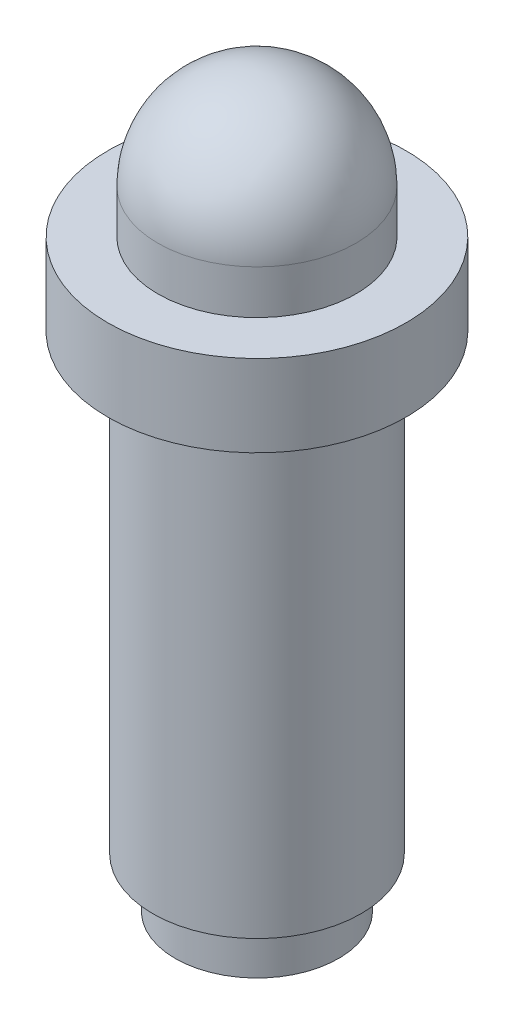
ISO-10303-21;
HEADER;
FILE_DESCRIPTION(('STEP AP214'),'2;1');
FILE_NAME('part.step','',(''),(''),'','','');
FILE_SCHEMA(('AUTOMOTIVE_DESIGN { 1 0 10303 214 1 1 1 1 }'));
ENDSEC;
DATA;
#1=APPLICATION_CONTEXT('core data for automotive mechanical design processes');
#2=APPLICATION_PROTOCOL_DEFINITION('international standard','automotive_design',2000,#1);
#3=PRODUCT_CONTEXT('',#1,'mechanical');
#4=PRODUCT('Part','Part','',(#3));
#5=PRODUCT_RELATED_PRODUCT_CATEGORY('part','',(#4));
#6=PRODUCT_DEFINITION_FORMATION('','',#4);
#7=PRODUCT_DEFINITION_CONTEXT('part definition',#1,'design');
#8=PRODUCT_DEFINITION('design','',#6,#7);
#9=PRODUCT_DEFINITION_SHAPE('','',#8);
#10=(LENGTH_UNIT() NAMED_UNIT(*) SI_UNIT(.MILLI.,.METRE.));
#11=(NAMED_UNIT(*) PLANE_ANGLE_UNIT() SI_UNIT($,.RADIAN.));
#12=(NAMED_UNIT(*) SI_UNIT($,.STERADIAN.) SOLID_ANGLE_UNIT());
#13=UNCERTAINTY_MEASURE_WITH_UNIT(LENGTH_MEASURE(1.E-05),#10,'distance_accuracy_value','');
#14=(GEOMETRIC_REPRESENTATION_CONTEXT(3) GLOBAL_UNCERTAINTY_ASSIGNED_CONTEXT((#13)) GLOBAL_UNIT_ASSIGNED_CONTEXT((#10,
#11,#12)) REPRESENTATION_CONTEXT('',''));
#15=CARTESIAN_POINT('',(0.,0.,0.));
#16=DIRECTION('',(0.,0.,1.));
#17=DIRECTION('',(1.,0.,0.));
#18=AXIS2_PLACEMENT_3D('',#15,#16,#17);
#19=CARTESIAN_POINT('',(0.,15.375,0.));
#20=DIRECTION('',(1.,0.,0.));
#21=DIRECTION('',(0.,0.,-1.));
#22=AXIS2_PLACEMENT_3D('',#19,#20,#21);
#23=SPHERICAL_SURFACE('',#22,2.425);
#24=CARTESIAN_POINT('',(0.,15.375,0.));
#25=DIRECTION('',(0.,1.,0.));
#26=DIRECTION('',(0.,0.,1.));
#27=AXIS2_PLACEMENT_3D('',#24,#25,#26);
#28=CIRCLE('',#27,2.425);
#29=CARTESIAN_POINT('',(-2.425,15.375,0.));
#30=VERTEX_POINT('',#29);
#31=CARTESIAN_POINT('',(2.425,15.375,0.));
#32=VERTEX_POINT('',#31);
#33=EDGE_CURVE('E30',#30,#32,#28,.F.);
#34=ORIENTED_EDGE('',*,*,#33,.F.);
#35=CARTESIAN_POINT('',(0.,15.375,0.));
#36=DIRECTION('',(0.,1.,0.));
#37=DIRECTION('',(0.,0.,1.));
#38=AXIS2_PLACEMENT_3D('',#35,#36,#37);
#39=CIRCLE('',#38,2.425);
#40=EDGE_CURVE('E32',#32,#30,#39,.F.);
#41=ORIENTED_EDGE('',*,*,#40,.F.);
#42=EDGE_LOOP('',(#34,#41));
#43=FACE_BOUND('',#42,.T.);
#44=ADVANCED_FACE('F14',(#43),#23,.T.);
#45=CARTESIAN_POINT('',(0.,-0.89,0.));
#46=DIRECTION('',(0.,1.,0.));
#47=DIRECTION('',(0.,0.,1.));
#48=AXIS2_PLACEMENT_3D('',#45,#46,#47);
#49=CYLINDRICAL_SURFACE('',#48,2.425);
#50=CARTESIAN_POINT('',(0.,14.3,0.));
#51=DIRECTION('',(0.,1.,0.));
#52=DIRECTION('',(0.,0.,1.));
#53=AXIS2_PLACEMENT_3D('',#50,#51,#52);
#54=CIRCLE('',#53,2.425);
#55=CARTESIAN_POINT('',(0.,14.3,2.425));
#56=VERTEX_POINT('',#55);
#57=EDGE_CURVE('E18',#56,#56,#54,.F.);
#58=ORIENTED_EDGE('',*,*,#57,.F.);
#59=EDGE_LOOP('',(#58));
#60=FACE_BOUND('',#59,.T.);
#61=ORIENTED_EDGE('',*,*,#40,.T.);
#62=ORIENTED_EDGE('',*,*,#33,.T.);
#63=EDGE_LOOP('',(#61,#62));
#64=FACE_BOUND('',#63,.T.);
#65=ADVANCED_FACE('F35',(#60,#64),#49,.T.);
#66=CARTESIAN_POINT('',(0.,0.,0.));
#67=DIRECTION('',(0.,1.,0.));
#68=DIRECTION('',(0.,0.,1.));
#69=AXIS2_PLACEMENT_3D('',#66,#67,#68);
#70=PLANE('',#69);
#71=CARTESIAN_POINT('',(0.,0.,0.));
#72=DIRECTION('',(0.,1.,0.));
#73=DIRECTION('',(0.,0.,1.));
#74=AXIS2_PLACEMENT_3D('',#71,#72,#73);
#75=CIRCLE('',#74,2.);
#76=CARTESIAN_POINT('',(0.,0.,2.));
#77=VERTEX_POINT('',#76);
#78=EDGE_CURVE('E53',#77,#77,#75,.T.);
#79=ORIENTED_EDGE('',*,*,#78,.F.);
#80=EDGE_LOOP('',(#79));
#81=FACE_BOUND('',#80,.T.);
#82=ADVANCED_FACE('F64',(#81),#70,.F.);
#83=CARTESIAN_POINT('',(0.,14.3,0.));
#84=DIRECTION('',(0.,1.,0.));
#85=DIRECTION('',(0.,0.,1.));
#86=AXIS2_PLACEMENT_3D('',#83,#84,#85);
#87=PLANE('',#86);
#88=ORIENTED_EDGE('',*,*,#57,.T.);
#89=EDGE_LOOP('',(#88));
#90=FACE_BOUND('',#89,.T.);
#91=CARTESIAN_POINT('',(0.,14.3,0.));
#92=DIRECTION('',(0.,1.,0.));
#93=DIRECTION('',(0.,0.,1.));
#94=AXIS2_PLACEMENT_3D('',#91,#92,#93);
#95=CIRCLE('',#94,3.65);
#96=CARTESIAN_POINT('',(0.,14.3,3.65));
#97=VERTEX_POINT('',#96);
#98=EDGE_CURVE('E51',#97,#97,#95,.F.);
#99=ORIENTED_EDGE('',*,*,#98,.F.);
#100=EDGE_LOOP('',(#99));
#101=FACE_BOUND('',#100,.T.);
#102=ADVANCED_FACE('F60',(#90,#101),#87,.T.);
#103=CARTESIAN_POINT('',(0.,-0.89,0.));
#104=DIRECTION('',(0.,1.,0.));
#105=DIRECTION('',(0.,0.,1.));
#106=AXIS2_PLACEMENT_3D('',#103,#104,#105);
#107=CYLINDRICAL_SURFACE('',#106,2.);
#108=ORIENTED_EDGE('',*,*,#78,.T.);
#109=EDGE_LOOP('',(#108));
#110=FACE_BOUND('',#109,.T.);
#111=CARTESIAN_POINT('',(0.,1.225,0.));
#112=DIRECTION('',(0.,1.,0.));
#113=DIRECTION('',(0.,0.,1.));
#114=AXIS2_PLACEMENT_3D('',#111,#112,#113);
#115=CIRCLE('',#114,2.);
#116=CARTESIAN_POINT('',(0.,1.225,2.));
#117=VERTEX_POINT('',#116);
#118=EDGE_CURVE('E48',#117,#117,#115,.F.);
#119=ORIENTED_EDGE('',*,*,#118,.T.);
#120=EDGE_LOOP('',(#119));
#121=FACE_BOUND('',#120,.T.);
#122=ADVANCED_FACE('F91',(#110,#121),#107,.T.);
#123=CARTESIAN_POINT('',(0.,-0.89,0.));
#124=DIRECTION('',(0.,1.,0.));
#125=DIRECTION('',(0.,0.,1.));
#126=AXIS2_PLACEMENT_3D('',#123,#124,#125);
#127=CYLINDRICAL_SURFACE('',#126,3.65);
#128=ORIENTED_EDGE('',*,*,#98,.T.);
#129=EDGE_LOOP('',(#128));
#130=FACE_BOUND('',#129,.T.);
#131=CARTESIAN_POINT('',(0.,12.3,0.));
#132=DIRECTION('',(0.,1.,0.));
#133=DIRECTION('',(0.,0.,1.));
#134=AXIS2_PLACEMENT_3D('',#131,#132,#133);
#135=CIRCLE('',#134,3.65);
#136=CARTESIAN_POINT('',(0.,12.3,3.65));
#137=VERTEX_POINT('',#136);
#138=EDGE_CURVE('E45',#137,#137,#135,.T.);
#139=ORIENTED_EDGE('',*,*,#138,.T.);
#140=EDGE_LOOP('',(#139));
#141=FACE_BOUND('',#140,.T.);
#142=ADVANCED_FACE('F87',(#130,#141),#127,.T.);
#143=CARTESIAN_POINT('',(0.,1.225,0.));
#144=DIRECTION('',(0.,1.,0.));
#145=DIRECTION('',(0.,0.,1.));
#146=AXIS2_PLACEMENT_3D('',#143,#144,#145);
#147=PLANE('',#146);
#148=ORIENTED_EDGE('',*,*,#118,.F.);
#149=EDGE_LOOP('',(#148));
#150=FACE_BOUND('',#149,.T.);
#151=CARTESIAN_POINT('',(0.,1.225,0.));
#152=DIRECTION('',(0.,1.,0.));
#153=DIRECTION('',(0.,0.,1.));
#154=AXIS2_PLACEMENT_3D('',#151,#152,#153);
#155=CIRCLE('',#154,2.55);
#156=CARTESIAN_POINT('',(0.,1.225,2.55));
#157=VERTEX_POINT('',#156);
#158=EDGE_CURVE('E23',#157,#157,#155,.T.);
#159=ORIENTED_EDGE('',*,*,#158,.F.);
#160=EDGE_LOOP('',(#159));
#161=FACE_BOUND('',#160,.T.);
#162=ADVANCED_FACE('F80',(#150,#161),#147,.F.);
#163=CARTESIAN_POINT('',(0.,12.3,0.));
#164=DIRECTION('',(0.,1.,0.));
#165=DIRECTION('',(0.,0.,1.));
#166=AXIS2_PLACEMENT_3D('',#163,#164,#165);
#167=PLANE('',#166);
#168=CARTESIAN_POINT('',(0.,12.3,0.));
#169=DIRECTION('',(0.,1.,0.));
#170=DIRECTION('',(0.,0.,1.));
#171=AXIS2_PLACEMENT_3D('',#168,#169,#170);
#172=CIRCLE('',#171,2.55);
#173=CARTESIAN_POINT('',(0.,12.3,2.55));
#174=VERTEX_POINT('',#173);
#175=EDGE_CURVE('E9',#174,#174,#172,.F.);
#176=ORIENTED_EDGE('',*,*,#175,.F.);
#177=EDGE_LOOP('',(#176));
#178=FACE_BOUND('',#177,.T.);
#179=ORIENTED_EDGE('',*,*,#138,.F.);
#180=EDGE_LOOP('',(#179));
#181=FACE_BOUND('',#180,.T.);
#182=ADVANCED_FACE('F74',(#178,#181),#167,.F.);
#183=CARTESIAN_POINT('',(0.,-0.89,0.));
#184=DIRECTION('',(0.,1.,0.));
#185=DIRECTION('',(0.,0.,1.));
#186=AXIS2_PLACEMENT_3D('',#183,#184,#185);
#187=CYLINDRICAL_SURFACE('',#186,2.55);
#188=ORIENTED_EDGE('',*,*,#175,.T.);
#189=EDGE_LOOP('',(#188));
#190=FACE_BOUND('',#189,.T.);
#191=ORIENTED_EDGE('',*,*,#158,.T.);
#192=EDGE_LOOP('',(#191));
#193=FACE_BOUND('',#192,.T.);
#194=ADVANCED_FACE('F72',(#190,#193),#187,.T.);
#195=CLOSED_SHELL('',(#44,#65,#82,#102,#122,#142,#162,#182,#194));
#196=MANIFOLD_SOLID_BREP('B1',#195);
#197=ADVANCED_BREP_SHAPE_REPRESENTATION('',(#18,#196),#14);
#198=SHAPE_DEFINITION_REPRESENTATION(#9,#197);
ENDSEC;
END-ISO-10303-21;
